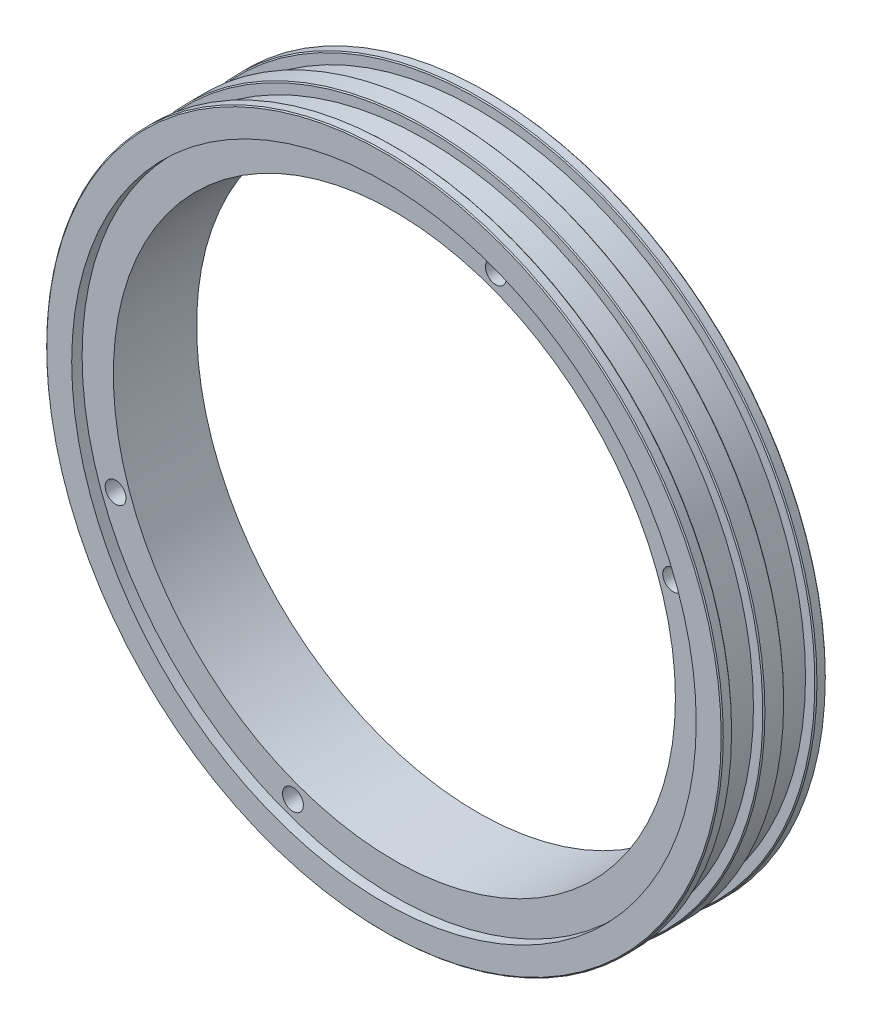
ISO-10303-21;
HEADER;
FILE_DESCRIPTION(('STEP AP214'),'2;1');
FILE_NAME('part.step','',(''),(''),'','','');
FILE_SCHEMA(('AUTOMOTIVE_DESIGN { 1 0 10303 214 1 1 1 1 }'));
ENDSEC;
DATA;
#1=APPLICATION_CONTEXT('core data for automotive mechanical design processes');
#2=APPLICATION_PROTOCOL_DEFINITION('international standard','automotive_design',2000,#1);
#3=PRODUCT_CONTEXT('',#1,'mechanical');
#4=PRODUCT('Part','Part','',(#3));
#5=PRODUCT_RELATED_PRODUCT_CATEGORY('part','',(#4));
#6=PRODUCT_DEFINITION_FORMATION('','',#4);
#7=PRODUCT_DEFINITION_CONTEXT('part definition',#1,'design');
#8=PRODUCT_DEFINITION('design','',#6,#7);
#9=PRODUCT_DEFINITION_SHAPE('','',#8);
#10=(LENGTH_UNIT() NAMED_UNIT(*) SI_UNIT(.MILLI.,.METRE.));
#11=(NAMED_UNIT(*) PLANE_ANGLE_UNIT() SI_UNIT($,.RADIAN.));
#12=(NAMED_UNIT(*) SI_UNIT($,.STERADIAN.) SOLID_ANGLE_UNIT());
#13=UNCERTAINTY_MEASURE_WITH_UNIT(LENGTH_MEASURE(1.E-05),#10,'distance_accuracy_value','');
#14=(GEOMETRIC_REPRESENTATION_CONTEXT(3) GLOBAL_UNCERTAINTY_ASSIGNED_CONTEXT((#13)) GLOBAL_UNIT_ASSIGNED_CONTEXT((#10,
#11,#12)) REPRESENTATION_CONTEXT('',''));
#15=CARTESIAN_POINT('',(0.,0.,0.));
#16=DIRECTION('',(0.,0.,1.));
#17=DIRECTION('',(1.,0.,0.));
#18=AXIS2_PLACEMENT_3D('',#15,#16,#17);
#19=CARTESIAN_POINT('',(0.,0.,2.54));
#20=DIRECTION('',(0.,0.,1.));
#21=DIRECTION('',(1.,0.,0.));
#22=AXIS2_PLACEMENT_3D('',#19,#20,#21);
#23=PLANE('',#22);
#24=CARTESIAN_POINT('',(24.7588381753444,68.0243488186899,2.54));
#25=DIRECTION('',(0.,0.,1.));
#26=DIRECTION('',(1.,0.,0.));
#27=AXIS2_PLACEMENT_3D('',#24,#25,#26);
#28=CIRCLE('',#27,2.54000000000188);
#29=CARTESIAN_POINT('',(27.2988381753462,68.0243488186899,2.54));
#30=VERTEX_POINT('',#29);
#31=EDGE_CURVE('E55',#30,#30,#28,.F.);
#32=ORIENTED_EDGE('',*,*,#31,.F.);
#33=EDGE_LOOP('',(#32));
#34=FACE_BOUND('',#33,.T.);
#35=CARTESIAN_POINT('',(68.0243488186919,24.7588381753451,2.54));
#36=DIRECTION('',(0.,0.,1.));
#37=DIRECTION('',(1.,0.,0.));
#38=AXIS2_PLACEMENT_3D('',#35,#36,#37);
#39=CIRCLE('',#38,2.53999999999999);
#40=CARTESIAN_POINT('',(70.5643488186919,24.7588381753451,2.54));
#41=VERTEX_POINT('',#40);
#42=EDGE_CURVE('E51',#41,#41,#39,.F.);
#43=ORIENTED_EDGE('',*,*,#42,.F.);
#44=EDGE_LOOP('',(#43));
#45=FACE_BOUND('',#44,.T.);
#46=CARTESIAN_POINT('',(0.,0.,2.54));
#47=DIRECTION('',(0.,0.,1.));
#48=DIRECTION('',(1.,0.,0.));
#49=AXIS2_PLACEMENT_3D('',#46,#47,#48);
#50=CIRCLE('',#49,68.58);
#51=CARTESIAN_POINT('',(68.58,0.,2.54));
#52=VERTEX_POINT('',#51);
#53=EDGE_CURVE('E95',#52,#52,#50,.T.);
#54=ORIENTED_EDGE('',*,*,#53,.T.);
#55=EDGE_LOOP('',(#54));
#56=FACE_BOUND('',#55,.T.);
#57=CARTESIAN_POINT('',(0.,0.,2.54));
#58=DIRECTION('',(0.,0.,1.));
#59=DIRECTION('',(1.,0.,0.));
#60=AXIS2_PLACEMENT_3D('',#57,#58,#59);
#61=CIRCLE('',#60,76.2);
#62=CARTESIAN_POINT('',(76.2,0.,2.54));
#63=VERTEX_POINT('',#62);
#64=EDGE_CURVE('E92',#63,#63,#61,.T.);
#65=ORIENTED_EDGE('',*,*,#64,.F.);
#66=EDGE_LOOP('',(#65));
#67=FACE_BOUND('',#66,.T.);
#68=CARTESIAN_POINT('',(-68.0243488186905,-24.7588381753438,2.54));
#69=DIRECTION('',(0.,0.,1.));
#70=DIRECTION('',(1.,0.,0.));
#71=AXIS2_PLACEMENT_3D('',#68,#69,#70);
#72=CIRCLE('',#71,2.54000000000224);
#73=CARTESIAN_POINT('',(-65.4843488186883,-24.7588381753438,2.54));
#74=VERTEX_POINT('',#73);
#75=EDGE_CURVE('E52',#74,#74,#72,.F.);
#76=ORIENTED_EDGE('',*,*,#75,.F.);
#77=EDGE_LOOP('',(#76));
#78=FACE_BOUND('',#77,.T.);
#79=CARTESIAN_POINT('',(-24.7588381753467,-68.0243488186936,2.54));
#80=DIRECTION('',(0.,0.,1.));
#81=DIRECTION('',(1.,0.,0.));
#82=AXIS2_PLACEMENT_3D('',#79,#80,#81);
#83=CIRCLE('',#82,2.53999999999895);
#84=CARTESIAN_POINT('',(-22.2188381753478,-68.0243488186936,2.54));
#85=VERTEX_POINT('',#84);
#86=EDGE_CURVE('E58',#85,#85,#83,.F.);
#87=ORIENTED_EDGE('',*,*,#86,.F.);
#88=EDGE_LOOP('',(#87));
#89=FACE_BOUND('',#88,.T.);
#90=ADVANCED_FACE('F31',(#34,#45,#56,#67,#78,#89),#23,.F.);
#91=CARTESIAN_POINT('',(0.,0.,22.86));
#92=DIRECTION('',(0.,0.,1.));
#93=DIRECTION('',(1.,0.,0.));
#94=AXIS2_PLACEMENT_3D('',#91,#92,#93);
#95=PLANE('',#94);
#96=CARTESIAN_POINT('',(24.7588381753444,68.0243488186899,22.86));
#97=DIRECTION('',(0.,0.,1.));
#98=DIRECTION('',(1.,0.,0.));
#99=AXIS2_PLACEMENT_3D('',#96,#97,#98);
#100=CIRCLE('',#99,2.54000000000188);
#101=CARTESIAN_POINT('',(27.2988381753462,68.0243488186899,22.86));
#102=VERTEX_POINT('',#101);
#103=EDGE_CURVE('E56',#102,#102,#100,.F.);
#104=ORIENTED_EDGE('',*,*,#103,.T.);
#105=EDGE_LOOP('',(#104));
#106=FACE_BOUND('',#105,.T.);
#107=CARTESIAN_POINT('',(68.0243488186919,24.7588381753451,22.86));
#108=DIRECTION('',(0.,0.,1.));
#109=DIRECTION('',(1.,0.,0.));
#110=AXIS2_PLACEMENT_3D('',#107,#108,#109);
#111=CIRCLE('',#110,2.53999999999999);
#112=CARTESIAN_POINT('',(70.5643488186919,24.7588381753451,22.86));
#113=VERTEX_POINT('',#112);
#114=EDGE_CURVE('E48',#113,#113,#111,.F.);
#115=ORIENTED_EDGE('',*,*,#114,.T.);
#116=EDGE_LOOP('',(#115));
#117=FACE_BOUND('',#116,.T.);
#118=CARTESIAN_POINT('',(0.,0.,22.86));
#119=DIRECTION('',(0.,0.,1.));
#120=DIRECTION('',(1.,0.,0.));
#121=AXIS2_PLACEMENT_3D('',#118,#119,#120);
#122=CIRCLE('',#121,68.58);
#123=CARTESIAN_POINT('',(68.58,0.,22.86));
#124=VERTEX_POINT('',#123);
#125=EDGE_CURVE('E89',#124,#124,#122,.T.);
#126=ORIENTED_EDGE('',*,*,#125,.F.);
#127=EDGE_LOOP('',(#126));
#128=FACE_BOUND('',#127,.T.);
#129=CARTESIAN_POINT('',(0.,0.,22.86));
#130=DIRECTION('',(0.,0.,1.));
#131=DIRECTION('',(1.,0.,0.));
#132=AXIS2_PLACEMENT_3D('',#129,#130,#131);
#133=CIRCLE('',#132,76.2);
#134=CARTESIAN_POINT('',(76.2,0.,22.86));
#135=VERTEX_POINT('',#134);
#136=EDGE_CURVE('E86',#135,#135,#133,.T.);
#137=ORIENTED_EDGE('',*,*,#136,.T.);
#138=EDGE_LOOP('',(#137));
#139=FACE_BOUND('',#138,.T.);
#140=CARTESIAN_POINT('',(-68.0243488186905,-24.7588381753438,22.86));
#141=DIRECTION('',(0.,0.,1.));
#142=DIRECTION('',(1.,0.,0.));
#143=AXIS2_PLACEMENT_3D('',#140,#141,#142);
#144=CIRCLE('',#143,2.54000000000224);
#145=CARTESIAN_POINT('',(-65.4843488186883,-24.7588381753438,22.86));
#146=VERTEX_POINT('',#145);
#147=EDGE_CURVE('E53',#146,#146,#144,.F.);
#148=ORIENTED_EDGE('',*,*,#147,.T.);
#149=EDGE_LOOP('',(#148));
#150=FACE_BOUND('',#149,.T.);
#151=CARTESIAN_POINT('',(-24.7588381753467,-68.0243488186936,22.86));
#152=DIRECTION('',(0.,0.,1.));
#153=DIRECTION('',(1.,0.,0.));
#154=AXIS2_PLACEMENT_3D('',#151,#152,#153);
#155=CIRCLE('',#154,2.53999999999895);
#156=CARTESIAN_POINT('',(-22.2188381753478,-68.0243488186936,22.86));
#157=VERTEX_POINT('',#156);
#158=EDGE_CURVE('E35',#157,#157,#155,.F.);
#159=ORIENTED_EDGE('',*,*,#158,.T.);
#160=EDGE_LOOP('',(#159));
#161=FACE_BOUND('',#160,.T.);
#162=ADVANCED_FACE('F167',(#106,#117,#128,#139,#150,#161),#95,.T.);
#163=CARTESIAN_POINT('',(0.,0.,25.4));
#164=DIRECTION('',(0.,0.,-1.));
#165=DIRECTION('',(-1.,0.,0.));
#166=AXIS2_PLACEMENT_3D('',#163,#164,#165);
#167=CYLINDRICAL_SURFACE('',#166,82.55);
#168=CARTESIAN_POINT('',(0.,0.,25.146));
#169=DIRECTION('',(0.,0.,1.));
#170=DIRECTION('',(1.,0.,0.));
#171=AXIS2_PLACEMENT_3D('',#168,#169,#170);
#172=CIRCLE('',#171,82.55);
#173=CARTESIAN_POINT('',(82.55,0.,25.146));
#174=VERTEX_POINT('',#173);
#175=EDGE_CURVE('E10',#174,#174,#172,.F.);
#176=ORIENTED_EDGE('',*,*,#175,.T.);
#177=EDGE_LOOP('',(#176));
#178=FACE_BOUND('',#177,.T.);
#179=CARTESIAN_POINT('',(0.,0.,23.1140000000001));
#180=DIRECTION('',(0.,0.,1.));
#181=DIRECTION('',(1.,0.,0.));
#182=AXIS2_PLACEMENT_3D('',#179,#180,#181);
#183=CIRCLE('',#182,82.55);
#184=CARTESIAN_POINT('',(82.55,0.,23.1140000000001));
#185=VERTEX_POINT('',#184);
#186=EDGE_CURVE('E124',#185,#185,#183,.T.);
#187=ORIENTED_EDGE('',*,*,#186,.T.);
#188=EDGE_LOOP('',(#187));
#189=FACE_BOUND('',#188,.T.);
#190=ADVANCED_FACE('F147',(#178,#189),#167,.T.);
#191=CARTESIAN_POINT('',(0.,0.,14.986));
#192=DIRECTION('',(0.,0.,-1.));
#193=DIRECTION('',(-1.,0.,0.));
#194=AXIS2_PLACEMENT_3D('',#191,#192,#193);
#195=CIRCLE('',#194,82.55);
#196=CARTESIAN_POINT('',(-82.55,0.,14.986));
#197=VERTEX_POINT('',#196);
#198=EDGE_CURVE('E109',#197,#197,#195,.T.);
#199=ORIENTED_EDGE('',*,*,#198,.T.);
#200=EDGE_LOOP('',(#199));
#201=FACE_BOUND('',#200,.T.);
#202=CARTESIAN_POINT('',(0.,0.,10.4140000000001));
#203=DIRECTION('',(0.,0.,1.));
#204=DIRECTION('',(1.,0.,0.));
#205=AXIS2_PLACEMENT_3D('',#202,#203,#204);
#206=CIRCLE('',#205,82.55);
#207=CARTESIAN_POINT('',(82.55,0.,10.4140000000001));
#208=VERTEX_POINT('',#207);
#209=EDGE_CURVE('E106',#208,#208,#206,.T.);
#210=ORIENTED_EDGE('',*,*,#209,.T.);
#211=EDGE_LOOP('',(#210));
#212=FACE_BOUND('',#211,.T.);
#213=ADVANCED_FACE('F148',(#201,#212),#167,.T.);
#214=CARTESIAN_POINT('',(0.,0.,25.4));
#215=DIRECTION('',(0.,0.,-1.));
#216=DIRECTION('',(-1.,0.,0.));
#217=AXIS2_PLACEMENT_3D('',#214,#215,#216);
#218=CYLINDRICAL_SURFACE('',#217,68.58);
#219=ORIENTED_EDGE('',*,*,#53,.F.);
#220=EDGE_LOOP('',(#219));
#221=FACE_BOUND('',#220,.T.);
#222=ORIENTED_EDGE('',*,*,#125,.T.);
#223=EDGE_LOOP('',(#222));
#224=FACE_BOUND('',#223,.T.);
#225=ADVANCED_FACE('F182',(#221,#224),#218,.F.);
#226=CARTESIAN_POINT('',(0.,0.,0.));
#227=DIRECTION('',(0.,0.,1.));
#228=DIRECTION('',(1.,0.,0.));
#229=AXIS2_PLACEMENT_3D('',#226,#227,#228);
#230=PLANE('',#229);
#231=CARTESIAN_POINT('',(0.,0.,0.));
#232=DIRECTION('',(0.,0.,1.));
#233=DIRECTION('',(1.,0.,0.));
#234=AXIS2_PLACEMENT_3D('',#231,#232,#233);
#235=CIRCLE('',#234,82.296);
#236=CARTESIAN_POINT('',(82.296,0.,0.));
#237=VERTEX_POINT('',#236);
#238=EDGE_CURVE('E44',#237,#237,#235,.F.);
#239=ORIENTED_EDGE('',*,*,#238,.T.);
#240=EDGE_LOOP('',(#239));
#241=FACE_BOUND('',#240,.T.);
#242=CARTESIAN_POINT('',(0.,0.,0.));
#243=DIRECTION('',(0.,0.,1.));
#244=DIRECTION('',(1.,0.,0.));
#245=AXIS2_PLACEMENT_3D('',#242,#243,#244);
#246=CIRCLE('',#245,76.2);
#247=CARTESIAN_POINT('',(76.2,0.,0.));
#248=VERTEX_POINT('',#247);
#249=EDGE_CURVE('E96',#248,#248,#246,.T.);
#250=ORIENTED_EDGE('',*,*,#249,.T.);
#251=EDGE_LOOP('',(#250));
#252=FACE_BOUND('',#251,.T.);
#253=ADVANCED_FACE('F132',(#241,#252),#230,.F.);
#254=CARTESIAN_POINT('',(0.,0.,25.4));
#255=DIRECTION('',(0.,0.,1.));
#256=DIRECTION('',(1.,0.,0.));
#257=AXIS2_PLACEMENT_3D('',#254,#255,#256);
#258=PLANE('',#257);
#259=CARTESIAN_POINT('',(0.,0.,25.4));
#260=DIRECTION('',(0.,0.,1.));
#261=DIRECTION('',(1.,0.,0.));
#262=AXIS2_PLACEMENT_3D('',#259,#260,#261);
#263=CIRCLE('',#262,82.296);
#264=CARTESIAN_POINT('',(82.296,0.,25.4));
#265=VERTEX_POINT('',#264);
#266=EDGE_CURVE('E39',#265,#265,#263,.T.);
#267=ORIENTED_EDGE('',*,*,#266,.T.);
#268=EDGE_LOOP('',(#267));
#269=FACE_BOUND('',#268,.T.);
#270=CARTESIAN_POINT('',(0.,0.,25.4));
#271=DIRECTION('',(0.,0.,1.));
#272=DIRECTION('',(1.,0.,0.));
#273=AXIS2_PLACEMENT_3D('',#270,#271,#272);
#274=CIRCLE('',#273,76.2);
#275=CARTESIAN_POINT('',(76.2,0.,25.4));
#276=VERTEX_POINT('',#275);
#277=EDGE_CURVE('E85',#276,#276,#274,.T.);
#278=ORIENTED_EDGE('',*,*,#277,.F.);
#279=EDGE_LOOP('',(#278));
#280=FACE_BOUND('',#279,.T.);
#281=ADVANCED_FACE('F145',(#269,#280),#258,.T.);
#282=CARTESIAN_POINT('',(0.,0.,0.254000000000018));
#283=DIRECTION('',(0.,0.,1.));
#284=DIRECTION('',(1.,0.,0.));
#285=AXIS2_PLACEMENT_3D('',#282,#283,#284);
#286=CIRCLE('',#285,82.55);
#287=CARTESIAN_POINT('',(82.55,0.,0.254000000000018));
#288=VERTEX_POINT('',#287);
#289=EDGE_CURVE('E127',#288,#288,#286,.T.);
#290=ORIENTED_EDGE('',*,*,#289,.T.);
#291=EDGE_LOOP('',(#290));
#292=FACE_BOUND('',#291,.T.);
#293=CARTESIAN_POINT('',(0.,0.,2.28599999999998));
#294=DIRECTION('',(0.,0.,-1.));
#295=DIRECTION('',(-1.,0.,0.));
#296=AXIS2_PLACEMENT_3D('',#293,#294,#295);
#297=CIRCLE('',#296,82.55);
#298=CARTESIAN_POINT('',(-82.55,0.,2.28599999999998));
#299=VERTEX_POINT('',#298);
#300=EDGE_CURVE('E115',#299,#299,#297,.T.);
#301=ORIENTED_EDGE('',*,*,#300,.T.);
#302=EDGE_LOOP('',(#301));
#303=FACE_BOUND('',#302,.T.);
#304=ADVANCED_FACE('F141',(#292,#303),#167,.T.);
#305=CARTESIAN_POINT('',(0.,0.,2.54));
#306=DIRECTION('',(0.,0.,-1.));
#307=DIRECTION('',(-1.,0.,0.));
#308=AXIS2_PLACEMENT_3D('',#305,#306,#307);
#309=CYLINDRICAL_SURFACE('',#308,76.2);
#310=ORIENTED_EDGE('',*,*,#64,.T.);
#311=EDGE_LOOP('',(#310));
#312=FACE_BOUND('',#311,.T.);
#313=ORIENTED_EDGE('',*,*,#249,.F.);
#314=EDGE_LOOP('',(#313));
#315=FACE_BOUND('',#314,.T.);
#316=ADVANCED_FACE('F144',(#312,#315),#309,.F.);
#317=CARTESIAN_POINT('',(0.,0.,22.86));
#318=DIRECTION('',(0.,0.,1.));
#319=DIRECTION('',(1.,0.,0.));
#320=AXIS2_PLACEMENT_3D('',#317,#318,#319);
#321=CYLINDRICAL_SURFACE('',#320,76.2);
#322=ORIENTED_EDGE('',*,*,#136,.F.);
#323=EDGE_LOOP('',(#322));
#324=FACE_BOUND('',#323,.T.);
#325=ORIENTED_EDGE('',*,*,#277,.T.);
#326=EDGE_LOOP('',(#325));
#327=FACE_BOUND('',#326,.T.);
#328=ADVANCED_FACE('F178',(#324,#327),#321,.F.);
#329=CARTESIAN_POINT('',(-82.55,0.,10.16));
#330=DIRECTION('',(0.,0.,1.));
#331=DIRECTION('',(1.,0.,0.));
#332=AXIS2_PLACEMENT_3D('',#329,#330,#331);
#333=PLANE('',#332);
#334=CARTESIAN_POINT('',(0.,0.,10.16));
#335=DIRECTION('',(0.,0.,1.));
#336=DIRECTION('',(1.,0.,0.));
#337=AXIS2_PLACEMENT_3D('',#334,#335,#336);
#338=CIRCLE('',#337,82.2959999999999);
#339=CARTESIAN_POINT('',(82.2959999999999,0.,10.16));
#340=VERTEX_POINT('',#339);
#341=EDGE_CURVE('E101',#340,#340,#338,.F.);
#342=ORIENTED_EDGE('',*,*,#341,.T.);
#343=EDGE_LOOP('',(#342));
#344=FACE_BOUND('',#343,.T.);
#345=CARTESIAN_POINT('',(0.,0.,10.16));
#346=DIRECTION('',(0.,0.,-1.));
#347=DIRECTION('',(-1.,0.,0.));
#348=AXIS2_PLACEMENT_3D('',#345,#346,#347);
#349=CIRCLE('',#348,80.01);
#350=CARTESIAN_POINT('',(-80.01,0.,10.16));
#351=VERTEX_POINT('',#350);
#352=EDGE_CURVE('E82',#351,#351,#349,.T.);
#353=ORIENTED_EDGE('',*,*,#352,.F.);
#354=EDGE_LOOP('',(#353));
#355=FACE_BOUND('',#354,.T.);
#356=ADVANCED_FACE('F204',(#344,#355),#333,.F.);
#357=CARTESIAN_POINT('',(0.,0.,0.));
#358=DIRECTION('',(0.,0.,-1.));
#359=DIRECTION('',(-1.,0.,0.));
#360=AXIS2_PLACEMENT_3D('',#357,#358,#359);
#361=CYLINDRICAL_SURFACE('',#360,80.01);
#362=CARTESIAN_POINT('',(0.,0.,2.54));
#363=DIRECTION('',(0.,0.,-1.));
#364=DIRECTION('',(-1.,0.,0.));
#365=AXIS2_PLACEMENT_3D('',#362,#363,#364);
#366=CIRCLE('',#365,80.01);
#367=CARTESIAN_POINT('',(-80.01,0.,2.54));
#368=VERTEX_POINT('',#367);
#369=EDGE_CURVE('E79',#368,#368,#366,.T.);
#370=ORIENTED_EDGE('',*,*,#369,.F.);
#371=EDGE_LOOP('',(#370));
#372=FACE_BOUND('',#371,.T.);
#373=ORIENTED_EDGE('',*,*,#352,.T.);
#374=EDGE_LOOP('',(#373));
#375=FACE_BOUND('',#374,.T.);
#376=ADVANCED_FACE('F207',(#372,#375),#361,.T.);
#377=CARTESIAN_POINT('',(-82.55,0.,2.54));
#378=DIRECTION('',(0.,0.,-1.));
#379=DIRECTION('',(-1.,0.,0.));
#380=AXIS2_PLACEMENT_3D('',#377,#378,#379);
#381=PLANE('',#380);
#382=CARTESIAN_POINT('',(0.,0.,2.54));
#383=DIRECTION('',(0.,0.,-1.));
#384=DIRECTION('',(-1.,0.,0.));
#385=AXIS2_PLACEMENT_3D('',#382,#383,#384);
#386=CIRCLE('',#385,82.296);
#387=CARTESIAN_POINT('',(-82.296,0.,2.54));
#388=VERTEX_POINT('',#387);
#389=EDGE_CURVE('E118',#388,#388,#386,.F.);
#390=ORIENTED_EDGE('',*,*,#389,.T.);
#391=EDGE_LOOP('',(#390));
#392=FACE_BOUND('',#391,.T.);
#393=ORIENTED_EDGE('',*,*,#369,.T.);
#394=EDGE_LOOP('',(#393));
#395=FACE_BOUND('',#394,.T.);
#396=ADVANCED_FACE('F212',(#392,#395),#381,.F.);
#397=CARTESIAN_POINT('',(-82.55,0.,22.86));
#398=DIRECTION('',(0.,0.,1.));
#399=DIRECTION('',(1.,0.,0.));
#400=AXIS2_PLACEMENT_3D('',#397,#398,#399);
#401=PLANE('',#400);
#402=CARTESIAN_POINT('',(0.,0.,22.86));
#403=DIRECTION('',(0.,0.,1.));
#404=DIRECTION('',(1.,0.,0.));
#405=AXIS2_PLACEMENT_3D('',#402,#403,#404);
#406=CIRCLE('',#405,82.2959999999999);
#407=CARTESIAN_POINT('',(82.2959999999999,0.,22.86));
#408=VERTEX_POINT('',#407);
#409=EDGE_CURVE('E121',#408,#408,#406,.F.);
#410=ORIENTED_EDGE('',*,*,#409,.T.);
#411=EDGE_LOOP('',(#410));
#412=FACE_BOUND('',#411,.T.);
#413=CARTESIAN_POINT('',(0.,0.,22.86));
#414=DIRECTION('',(0.,0.,-1.));
#415=DIRECTION('',(-1.,0.,0.));
#416=AXIS2_PLACEMENT_3D('',#413,#414,#415);
#417=CIRCLE('',#416,80.01);
#418=CARTESIAN_POINT('',(-80.01,0.,22.86));
#419=VERTEX_POINT('',#418);
#420=EDGE_CURVE('E73',#419,#419,#417,.T.);
#421=ORIENTED_EDGE('',*,*,#420,.F.);
#422=EDGE_LOOP('',(#421));
#423=FACE_BOUND('',#422,.T.);
#424=ADVANCED_FACE('F218',(#412,#423),#401,.F.);
#425=CARTESIAN_POINT('',(-82.55,0.,15.24));
#426=DIRECTION('',(0.,0.,-1.));
#427=DIRECTION('',(-1.,0.,0.));
#428=AXIS2_PLACEMENT_3D('',#425,#426,#427);
#429=PLANE('',#428);
#430=CARTESIAN_POINT('',(0.,0.,15.24));
#431=DIRECTION('',(0.,0.,-1.));
#432=DIRECTION('',(-1.,0.,0.));
#433=AXIS2_PLACEMENT_3D('',#430,#431,#432);
#434=CIRCLE('',#433,82.296);
#435=CARTESIAN_POINT('',(-82.296,0.,15.24));
#436=VERTEX_POINT('',#435);
#437=EDGE_CURVE('E112',#436,#436,#434,.F.);
#438=ORIENTED_EDGE('',*,*,#437,.T.);
#439=EDGE_LOOP('',(#438));
#440=FACE_BOUND('',#439,.T.);
#441=CARTESIAN_POINT('',(0.,0.,15.24));
#442=DIRECTION('',(0.,0.,-1.));
#443=DIRECTION('',(-1.,0.,0.));
#444=AXIS2_PLACEMENT_3D('',#441,#442,#443);
#445=CIRCLE('',#444,80.01);
#446=CARTESIAN_POINT('',(-80.01,0.,15.24));
#447=VERTEX_POINT('',#446);
#448=EDGE_CURVE('E76',#447,#447,#445,.T.);
#449=ORIENTED_EDGE('',*,*,#448,.T.);
#450=EDGE_LOOP('',(#449));
#451=FACE_BOUND('',#450,.T.);
#452=ADVANCED_FACE('F197',(#440,#451),#429,.F.);
#453=CARTESIAN_POINT('',(0.,0.,0.));
#454=DIRECTION('',(0.,0.,-1.));
#455=DIRECTION('',(-1.,0.,0.));
#456=AXIS2_PLACEMENT_3D('',#453,#454,#455);
#457=CYLINDRICAL_SURFACE('',#456,80.01);
#458=ORIENTED_EDGE('',*,*,#448,.F.);
#459=EDGE_LOOP('',(#458));
#460=FACE_BOUND('',#459,.T.);
#461=ORIENTED_EDGE('',*,*,#420,.T.);
#462=EDGE_LOOP('',(#461));
#463=FACE_BOUND('',#462,.T.);
#464=ADVANCED_FACE('F192',(#460,#463),#457,.T.);
#465=CARTESIAN_POINT('',(0.,0.,10.16));
#466=DIRECTION('',(0.,0.,1.));
#467=DIRECTION('',(1.,0.,0.));
#468=AXIS2_PLACEMENT_3D('',#465,#466,#467);
#469=CONICAL_SURFACE('',#468,82.2959999999999,0.785398163397476);
#470=CARTESIAN_POINT('',(82.55,0.,10.4140000000001));
#471=CARTESIAN_POINT('',(82.5473541666667,0.,10.4113541666667));
#472=CARTESIAN_POINT('',(82.5447083333333,0.,10.4087083333334));
#473=CARTESIAN_POINT('',(82.5394166666667,0.,10.4034166666667));
#474=CARTESIAN_POINT('',(82.5367708333333,0.,10.4007708333334));
#475=CARTESIAN_POINT('',(82.5314791666667,0.,10.3954791666667));
#476=CARTESIAN_POINT('',(82.5288333333333,0.,10.3928333333334));
#477=CARTESIAN_POINT('',(82.5235416666667,0.,10.3875416666667));
#478=CARTESIAN_POINT('',(82.5208958333333,0.,10.3848958333334));
#479=CARTESIAN_POINT('',(82.5156041666667,0.,10.3796041666667));
#480=CARTESIAN_POINT('',(82.5129583333333,0.,10.3769583333334));
#481=CARTESIAN_POINT('',(82.5076666666667,0.,10.3716666666667));
#482=CARTESIAN_POINT('',(82.5050208333333,0.,10.3690208333334));
#483=CARTESIAN_POINT('',(82.4997291666666,0.,10.3637291666667));
#484=CARTESIAN_POINT('',(82.4970833333333,0.,10.3610833333334));
#485=CARTESIAN_POINT('',(82.4917916666666,0.,10.3557916666667));
#486=CARTESIAN_POINT('',(82.4891458333333,0.,10.3531458333334));
#487=CARTESIAN_POINT('',(82.4838541666666,0.,10.3478541666667));
#488=CARTESIAN_POINT('',(82.4812083333333,0.,10.3452083333334));
#489=CARTESIAN_POINT('',(82.4759166666666,0.,10.3399166666667));
#490=CARTESIAN_POINT('',(82.4732708333333,0.,10.3372708333334));
#491=CARTESIAN_POINT('',(82.4679791666667,0.,10.3319791666667));
#492=CARTESIAN_POINT('',(82.4653333333333,0.,10.3293333333334));
#493=CARTESIAN_POINT('',(82.4600416666666,0.,10.3240416666667));
#494=CARTESIAN_POINT('',(82.4573958333333,0.,10.3213958333334));
#495=CARTESIAN_POINT('',(82.4521041666666,0.,10.3161041666667));
#496=CARTESIAN_POINT('',(82.4494583333333,0.,10.3134583333334));
#497=CARTESIAN_POINT('',(82.4441666666666,0.,10.3081666666667));
#498=CARTESIAN_POINT('',(82.4415208333333,0.,10.3055208333334));
#499=CARTESIAN_POINT('',(82.4362291666666,0.,10.3002291666667));
#500=CARTESIAN_POINT('',(82.4335833333333,0.,10.2975833333334));
#501=CARTESIAN_POINT('',(82.4282916666666,0.,10.2922916666667));
#502=CARTESIAN_POINT('',(82.4256458333333,0.,10.2896458333334));
#503=CARTESIAN_POINT('',(82.4203541666666,0.,10.2843541666667));
#504=CARTESIAN_POINT('',(82.4177083333333,0.,10.2817083333334));
#505=CARTESIAN_POINT('',(82.4124166666666,0.,10.2764166666667));
#506=CARTESIAN_POINT('',(82.4097708333333,0.,10.2737708333334));
#507=CARTESIAN_POINT('',(82.4044791666666,0.,10.2684791666667));
#508=CARTESIAN_POINT('',(82.4018333333333,0.,10.2658333333334));
#509=CARTESIAN_POINT('',(82.3965416666666,0.,10.2605416666667));
#510=CARTESIAN_POINT('',(82.3938958333333,0.,10.2578958333334));
#511=CARTESIAN_POINT('',(82.3886041666666,0.,10.2526041666667));
#512=CARTESIAN_POINT('',(82.3859583333333,0.,10.2499583333334));
#513=CARTESIAN_POINT('',(82.3806666666666,0.,10.2446666666667));
#514=CARTESIAN_POINT('',(82.3780208333333,0.,10.2420208333334));
#515=CARTESIAN_POINT('',(82.3727291666666,0.,10.2367291666667));
#516=CARTESIAN_POINT('',(82.3700833333333,0.,10.2340833333334));
#517=CARTESIAN_POINT('',(82.3647916666666,0.,10.2287916666667));
#518=CARTESIAN_POINT('',(82.3621458333333,0.,10.2261458333333));
#519=CARTESIAN_POINT('',(82.3568541666666,0.,10.2208541666667));
#520=CARTESIAN_POINT('',(82.3542083333333,0.,10.2182083333333));
#521=CARTESIAN_POINT('',(82.3489166666666,0.,10.2129166666667));
#522=CARTESIAN_POINT('',(82.3462708333333,0.,10.2102708333333));
#523=CARTESIAN_POINT('',(82.3409791666666,0.,10.2049791666667));
#524=CARTESIAN_POINT('',(82.3383333333333,0.,10.2023333333333));
#525=CARTESIAN_POINT('',(82.3330416666666,0.,10.1970416666667));
#526=CARTESIAN_POINT('',(82.3303958333333,0.,10.1943958333333));
#527=CARTESIAN_POINT('',(82.3251041666666,0.,10.1891041666667));
#528=CARTESIAN_POINT('',(82.3224583333333,0.,10.1864583333333));
#529=CARTESIAN_POINT('',(82.3171666666666,0.,10.1811666666667));
#530=CARTESIAN_POINT('',(82.3145208333333,0.,10.1785208333333));
#531=CARTESIAN_POINT('',(82.3092291666666,0.,10.1732291666667));
#532=CARTESIAN_POINT('',(82.3065833333333,0.,10.1705833333333));
#533=CARTESIAN_POINT('',(82.3012916666666,0.,10.1652916666667));
#534=CARTESIAN_POINT('',(82.2986458333333,0.,10.1626458333333));
#535=CARTESIAN_POINT('',(82.2959999999999,0.,10.16));
#536=B_SPLINE_CURVE_WITH_KNOTS('',3,(#470,#471,#472,#473,#474,#475,#476,#477,#478,#479,#480,
#481,#482,#483,#484,#485,#486,#487,#488,#489,#490,#491,#492,#493,#494,#495,#496,#497,#498,#499,
#500,#501,#502,#503,#504,#505,#506,#507,#508,#509,#510,#511,#512,#513,#514,#515,#516,#517,#518,
#519,#520,#521,#522,#523,#524,#525,#526,#527,#528,#529,#530,#531,#532,#533,#534,#535),
.UNSPECIFIED.,.F.,.F.,(4,2,2,2,2,2,2,2,2,2,2,2,2,2,2,2,2,2,2,2,2,2,2,2,2,2,2,2,2,2,2,2,4),(0.,
0.0112253201513366,0.0224506403026843,0.0336759604540209,0.0449012806053588,0.0561266007566954,
0.0673519209080333,0.0785772410593797,0.0898025612107176,0.101027881362054,0.112253201513392,
0.123478521664729,0.134703841816076,0.145929161967413,0.157154482118751,0.168379802270087,
0.179605122421435,0.190830442572772,0.20205576272411,0.213281082875446,0.224506403026784,
0.235731723178131,0.246957043329468,0.258182363480805,0.269407683632143,0.280633003783489,
0.291858323934827,0.303083644086164,0.314308964237502,0.325534284388838,0.336759604540186,
0.347984924691522,0.359210244842859),.UNSPECIFIED.);
#537=EDGE_CURVE('BSEAM162',#208,#340,#536,.T.);
#538=ORIENTED_EDGE('',*,*,#209,.F.);
#539=ORIENTED_EDGE('',*,*,#341,.F.);
#540=ORIENTED_EDGE('',*,*,#537,.T.);
#541=ORIENTED_EDGE('',*,*,#537,.F.);
#542=EDGE_LOOP('',(#538,#540,#539,#541));
#543=FACE_BOUND('',#542,.T.);
#544=ADVANCED_FACE('F162',(#543),#469,.T.);
#545=CARTESIAN_POINT('',(0.,0.,14.986));
#546=DIRECTION('',(0.,0.,-1.));
#547=DIRECTION('',(-1.,0.,0.));
#548=AXIS2_PLACEMENT_3D('',#545,#546,#547);
#549=CONICAL_SURFACE('',#548,82.55,0.785398163397448);
#550=ORIENTED_EDGE('',*,*,#437,.F.);
#551=EDGE_LOOP('',(#550));
#552=FACE_BOUND('',#551,.T.);
#553=ORIENTED_EDGE('',*,*,#198,.F.);
#554=EDGE_LOOP('',(#553));
#555=FACE_BOUND('',#554,.T.);
#556=ADVANCED_FACE('F153',(#552,#555),#549,.T.);
#557=CARTESIAN_POINT('',(0.,0.,2.28599999999998));
#558=DIRECTION('',(0.,0.,-1.));
#559=DIRECTION('',(-1.,0.,0.));
#560=AXIS2_PLACEMENT_3D('',#557,#558,#559);
#561=CONICAL_SURFACE('',#560,82.55,0.785398163397448);
#562=ORIENTED_EDGE('',*,*,#389,.F.);
#563=EDGE_LOOP('',(#562));
#564=FACE_BOUND('',#563,.T.);
#565=ORIENTED_EDGE('',*,*,#300,.F.);
#566=EDGE_LOOP('',(#565));
#567=FACE_BOUND('',#566,.T.);
#568=ADVANCED_FACE('F151',(#564,#567),#561,.T.);
#569=CARTESIAN_POINT('',(0.,0.,22.86));
#570=DIRECTION('',(0.,0.,1.));
#571=DIRECTION('',(1.,0.,0.));
#572=AXIS2_PLACEMENT_3D('',#569,#570,#571);
#573=CONICAL_SURFACE('',#572,82.2959999999999,0.785398163397476);
#574=CARTESIAN_POINT('',(82.55,0.,23.1140000000001));
#575=CARTESIAN_POINT('',(82.5473541666667,0.,23.1113541666667));
#576=CARTESIAN_POINT('',(82.5447083333333,0.,23.1087083333334));
#577=CARTESIAN_POINT('',(82.5394166666667,0.,23.1034166666667));
#578=CARTESIAN_POINT('',(82.5367708333333,0.,23.1007708333334));
#579=CARTESIAN_POINT('',(82.5314791666667,0.,23.0954791666667));
#580=CARTESIAN_POINT('',(82.5288333333333,0.,23.0928333333334));
#581=CARTESIAN_POINT('',(82.5235416666667,0.,23.0875416666667));
#582=CARTESIAN_POINT('',(82.5208958333333,0.,23.0848958333334));
#583=CARTESIAN_POINT('',(82.5156041666667,0.,23.0796041666667));
#584=CARTESIAN_POINT('',(82.5129583333333,0.,23.0769583333334));
#585=CARTESIAN_POINT('',(82.5076666666667,0.,23.0716666666667));
#586=CARTESIAN_POINT('',(82.5050208333333,0.,23.0690208333334));
#587=CARTESIAN_POINT('',(82.4997291666666,0.,23.0637291666667));
#588=CARTESIAN_POINT('',(82.4970833333333,0.,23.0610833333334));
#589=CARTESIAN_POINT('',(82.4917916666666,0.,23.0557916666667));
#590=CARTESIAN_POINT('',(82.4891458333333,0.,23.0531458333334));
#591=CARTESIAN_POINT('',(82.4838541666666,0.,23.0478541666667));
#592=CARTESIAN_POINT('',(82.4812083333333,0.,23.0452083333334));
#593=CARTESIAN_POINT('',(82.4759166666666,0.,23.0399166666667));
#594=CARTESIAN_POINT('',(82.4732708333333,0.,23.0372708333334));
#595=CARTESIAN_POINT('',(82.4679791666666,0.,23.0319791666667));
#596=CARTESIAN_POINT('',(82.4653333333333,0.,23.0293333333334));
#597=CARTESIAN_POINT('',(82.4600416666666,0.,23.0240416666667));
#598=CARTESIAN_POINT('',(82.4573958333333,0.,23.0213958333334));
#599=CARTESIAN_POINT('',(82.4521041666666,0.,23.0161041666667));
#600=CARTESIAN_POINT('',(82.4494583333333,0.,23.0134583333334));
#601=CARTESIAN_POINT('',(82.4441666666666,0.,23.0081666666667));
#602=CARTESIAN_POINT('',(82.4415208333333,0.,23.0055208333334));
#603=CARTESIAN_POINT('',(82.4362291666666,0.,23.0002291666667));
#604=CARTESIAN_POINT('',(82.4335833333333,0.,22.9975833333334));
#605=CARTESIAN_POINT('',(82.4282916666666,0.,22.9922916666667));
#606=CARTESIAN_POINT('',(82.4256458333333,0.,22.9896458333334));
#607=CARTESIAN_POINT('',(82.4203541666666,0.,22.9843541666667));
#608=CARTESIAN_POINT('',(82.4177083333333,0.,22.9817083333334));
#609=CARTESIAN_POINT('',(82.4124166666666,0.,22.9764166666667));
#610=CARTESIAN_POINT('',(82.4097708333333,0.,22.9737708333334));
#611=CARTESIAN_POINT('',(82.4044791666666,0.,22.9684791666667));
#612=CARTESIAN_POINT('',(82.4018333333333,0.,22.9658333333334));
#613=CARTESIAN_POINT('',(82.3965416666666,0.,22.9605416666667));
#614=CARTESIAN_POINT('',(82.3938958333333,0.,22.9578958333334));
#615=CARTESIAN_POINT('',(82.3886041666666,0.,22.9526041666667));
#616=CARTESIAN_POINT('',(82.3859583333333,0.,22.9499583333334));
#617=CARTESIAN_POINT('',(82.3806666666666,0.,22.9446666666667));
#618=CARTESIAN_POINT('',(82.3780208333333,0.,22.9420208333334));
#619=CARTESIAN_POINT('',(82.3727291666666,0.,22.9367291666667));
#620=CARTESIAN_POINT('',(82.3700833333333,0.,22.9340833333333));
#621=CARTESIAN_POINT('',(82.3647916666666,0.,22.9287916666667));
#622=CARTESIAN_POINT('',(82.3621458333333,0.,22.9261458333333));
#623=CARTESIAN_POINT('',(82.3568541666666,0.,22.9208541666667));
#624=CARTESIAN_POINT('',(82.3542083333333,0.,22.9182083333333));
#625=CARTESIAN_POINT('',(82.3489166666666,0.,22.9129166666667));
#626=CARTESIAN_POINT('',(82.3462708333333,0.,22.9102708333333));
#627=CARTESIAN_POINT('',(82.3409791666666,0.,22.9049791666667));
#628=CARTESIAN_POINT('',(82.3383333333333,0.,22.9023333333333));
#629=CARTESIAN_POINT('',(82.3330416666666,0.,22.8970416666667));
#630=CARTESIAN_POINT('',(82.3303958333333,0.,22.8943958333333));
#631=CARTESIAN_POINT('',(82.3251041666666,0.,22.8891041666667));
#632=CARTESIAN_POINT('',(82.3224583333333,0.,22.8864583333333));
#633=CARTESIAN_POINT('',(82.3171666666666,0.,22.8811666666667));
#634=CARTESIAN_POINT('',(82.3145208333333,0.,22.8785208333333));
#635=CARTESIAN_POINT('',(82.3092291666666,0.,22.8732291666667));
#636=CARTESIAN_POINT('',(82.3065833333333,0.,22.8705833333333));
#637=CARTESIAN_POINT('',(82.3012916666666,0.,22.8652916666667));
#638=CARTESIAN_POINT('',(82.2986458333333,0.,22.8626458333333));
#639=CARTESIAN_POINT('',(82.2959999999999,0.,22.86));
#640=B_SPLINE_CURVE_WITH_KNOTS('',3,(#574,#575,#576,#577,#578,#579,#580,#581,#582,#583,#584,
#585,#586,#587,#588,#589,#590,#591,#592,#593,#594,#595,#596,#597,#598,#599,#600,#601,#602,#603,
#604,#605,#606,#607,#608,#609,#610,#611,#612,#613,#614,#615,#616,#617,#618,#619,#620,#621,#622,
#623,#624,#625,#626,#627,#628,#629,#630,#631,#632,#633,#634,#635,#636,#637,#638,#639),
.UNSPECIFIED.,.F.,.F.,(4,2,2,2,2,2,2,2,2,2,2,2,2,2,2,2,2,2,2,2,2,2,2,2,2,2,2,2,2,2,2,2,4),(0.,
0.0112253201513354,0.0224506403026831,0.0336759604540209,0.0449012806053588,0.0561266007566942,
0.067351920908032,0.0785772410593797,0.0898025612107176,0.101027881362053,0.112253201513391,
0.123478521664738,0.134703841816076,0.145929161967412,0.15715448211875,0.168379802270087,
0.179605122421435,0.19083044257277,0.202055762724108,0.213281082875446,0.224506403026794,
0.235731723178129,0.246957043329467,0.258182363480805,0.269407683632143,0.280633003783488,
0.291858323934826,0.303083644086164,0.314308964237502,0.325534284388837,0.336759604540185,
0.347984924691523,0.359210244842858),.UNSPECIFIED.);
#641=EDGE_CURVE('BSEAM138',#185,#408,#640,.T.);
#642=ORIENTED_EDGE('',*,*,#186,.F.);
#643=ORIENTED_EDGE('',*,*,#409,.F.);
#644=ORIENTED_EDGE('',*,*,#641,.T.);
#645=ORIENTED_EDGE('',*,*,#641,.F.);
#646=EDGE_LOOP('',(#642,#644,#643,#645));
#647=FACE_BOUND('',#646,.T.);
#648=ADVANCED_FACE('F138',(#647),#573,.T.);
#649=CARTESIAN_POINT('',(0.,0.,0.254000000000018));
#650=DIRECTION('',(0.,0.,1.));
#651=DIRECTION('',(1.,0.,0.));
#652=AXIS2_PLACEMENT_3D('',#649,#650,#651);
#653=CONICAL_SURFACE('',#652,82.55,0.785398163397448);
#654=ORIENTED_EDGE('',*,*,#238,.F.);
#655=EDGE_LOOP('',(#654));
#656=FACE_BOUND('',#655,.T.);
#657=ORIENTED_EDGE('',*,*,#289,.F.);
#658=EDGE_LOOP('',(#657));
#659=FACE_BOUND('',#658,.T.);
#660=ADVANCED_FACE('F135',(#656,#659),#653,.T.);
#661=CARTESIAN_POINT('',(0.,0.,25.4));
#662=DIRECTION('',(0.,0.,-1.));
#663=DIRECTION('',(-1.,0.,0.));
#664=AXIS2_PLACEMENT_3D('',#661,#662,#663);
#665=CONICAL_SURFACE('',#664,82.296,0.785398163397476);
#666=ORIENTED_EDGE('',*,*,#175,.F.);
#667=EDGE_LOOP('',(#666));
#668=FACE_BOUND('',#667,.T.);
#669=ORIENTED_EDGE('',*,*,#266,.F.);
#670=EDGE_LOOP('',(#669));
#671=FACE_BOUND('',#670,.T.);
#672=ADVANCED_FACE('F33',(#668,#671),#665,.T.);
#673=CARTESIAN_POINT('',(68.0243488186919,24.7588381753451,25.4));
#674=DIRECTION('',(0.,0.,-1.));
#675=DIRECTION('',(-1.,0.,0.));
#676=AXIS2_PLACEMENT_3D('',#673,#674,#675);
#677=CYLINDRICAL_SURFACE('',#676,2.53999999999999);
#678=ORIENTED_EDGE('',*,*,#114,.F.);
#679=EDGE_LOOP('',(#678));
#680=FACE_BOUND('',#679,.T.);
#681=ORIENTED_EDGE('',*,*,#42,.T.);
#682=EDGE_LOOP('',(#681));
#683=FACE_BOUND('',#682,.T.);
#684=ADVANCED_FACE('F229',(#680,#683),#677,.F.);
#685=CARTESIAN_POINT('',(-68.0243488186905,-24.7588381753438,25.4));
#686=DIRECTION('',(0.,0.,-1.));
#687=DIRECTION('',(-1.,0.,0.));
#688=AXIS2_PLACEMENT_3D('',#685,#686,#687);
#689=CYLINDRICAL_SURFACE('',#688,2.54000000000224);
#690=ORIENTED_EDGE('',*,*,#147,.F.);
#691=EDGE_LOOP('',(#690));
#692=FACE_BOUND('',#691,.T.);
#693=ORIENTED_EDGE('',*,*,#75,.T.);
#694=EDGE_LOOP('',(#693));
#695=FACE_BOUND('',#694,.T.);
#696=ADVANCED_FACE('F232',(#692,#695),#689,.F.);
#697=CARTESIAN_POINT('',(24.7588381753444,68.0243488186899,25.4));
#698=DIRECTION('',(0.,0.,-1.));
#699=DIRECTION('',(-1.,0.,0.));
#700=AXIS2_PLACEMENT_3D('',#697,#698,#699);
#701=CYLINDRICAL_SURFACE('',#700,2.54000000000188);
#702=ORIENTED_EDGE('',*,*,#103,.F.);
#703=EDGE_LOOP('',(#702));
#704=FACE_BOUND('',#703,.T.);
#705=ORIENTED_EDGE('',*,*,#31,.T.);
#706=EDGE_LOOP('',(#705));
#707=FACE_BOUND('',#706,.T.);
#708=ADVANCED_FACE('F236',(#704,#707),#701,.F.);
#709=CARTESIAN_POINT('',(-24.7588381753467,-68.0243488186936,25.4));
#710=DIRECTION('',(0.,0.,-1.));
#711=DIRECTION('',(-1.,0.,0.));
#712=AXIS2_PLACEMENT_3D('',#709,#710,#711);
#713=CYLINDRICAL_SURFACE('',#712,2.53999999999895);
#714=ORIENTED_EDGE('',*,*,#158,.F.);
#715=EDGE_LOOP('',(#714));
#716=FACE_BOUND('',#715,.T.);
#717=ORIENTED_EDGE('',*,*,#86,.T.);
#718=EDGE_LOOP('',(#717));
#719=FACE_BOUND('',#718,.T.);
#720=ADVANCED_FACE('F240',(#716,#719),#713,.F.);
#721=CLOSED_SHELL('',(#90,#162,#190,#213,#225,#253,#281,#304,#316,#328,#356,#376,#396,#424,#452,
#464,#544,#556,#568,#648,#660,#672,#684,#696,#708,#720));
#722=MANIFOLD_SOLID_BREP('B2',#721);
#723=ADVANCED_BREP_SHAPE_REPRESENTATION('',(#18,#722),#14);
#724=SHAPE_DEFINITION_REPRESENTATION(#9,#723);
ENDSEC;
END-ISO-10303-21;
